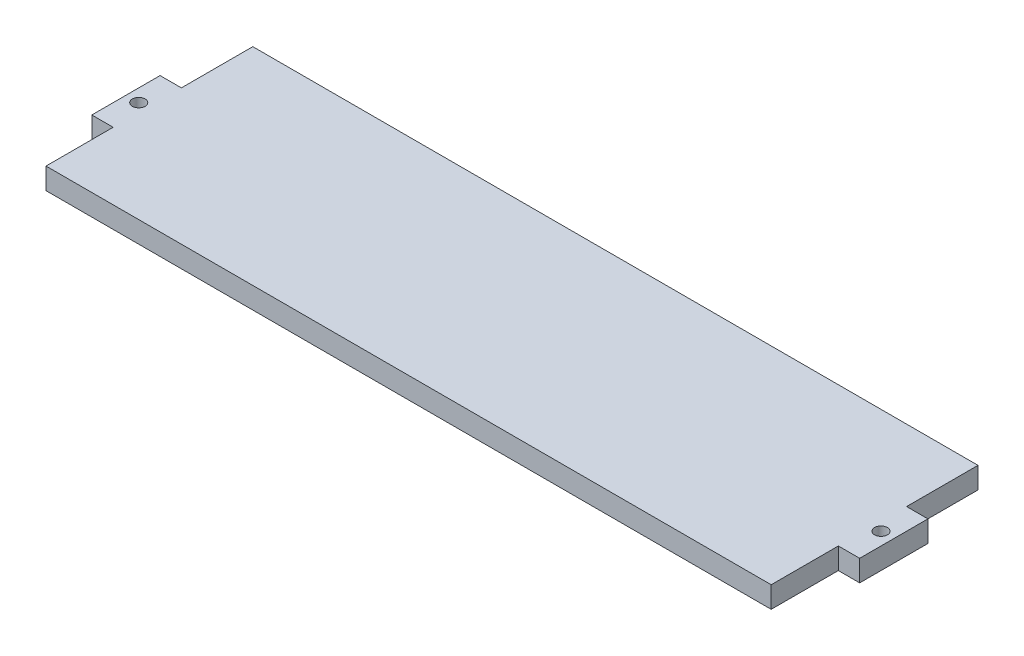
ISO-10303-21;
HEADER;
FILE_DESCRIPTION(('STEP AP214'),'2;1');
FILE_NAME('part.step','',(''),(''),'','','');
FILE_SCHEMA(('AUTOMOTIVE_DESIGN { 1 0 10303 214 1 1 1 1 }'));
ENDSEC;
DATA;
#1=APPLICATION_CONTEXT('core data for automotive mechanical design processes');
#2=APPLICATION_PROTOCOL_DEFINITION('international standard','automotive_design',2000,#1);
#3=PRODUCT_CONTEXT('',#1,'mechanical');
#4=PRODUCT('Part','Part','',(#3));
#5=PRODUCT_RELATED_PRODUCT_CATEGORY('part','',(#4));
#6=PRODUCT_DEFINITION_FORMATION('','',#4);
#7=PRODUCT_DEFINITION_CONTEXT('part definition',#1,'design');
#8=PRODUCT_DEFINITION('design','',#6,#7);
#9=PRODUCT_DEFINITION_SHAPE('','',#8);
#10=(LENGTH_UNIT() NAMED_UNIT(*) SI_UNIT(.MILLI.,.METRE.));
#11=(NAMED_UNIT(*) PLANE_ANGLE_UNIT() SI_UNIT($,.RADIAN.));
#12=(NAMED_UNIT(*) SI_UNIT($,.STERADIAN.) SOLID_ANGLE_UNIT());
#13=UNCERTAINTY_MEASURE_WITH_UNIT(LENGTH_MEASURE(1.E-05),#10,'distance_accuracy_value','');
#14=(GEOMETRIC_REPRESENTATION_CONTEXT(3) GLOBAL_UNCERTAINTY_ASSIGNED_CONTEXT((#13)) GLOBAL_UNIT_ASSIGNED_CONTEXT((#10,
#11,#12)) REPRESENTATION_CONTEXT('',''));
#15=CARTESIAN_POINT('',(0.,0.,0.));
#16=DIRECTION('',(0.,0.,1.));
#17=DIRECTION('',(1.,0.,0.));
#18=AXIS2_PLACEMENT_3D('',#15,#16,#17);
#19=CARTESIAN_POINT('',(90.0000000000002,5.,7.99999999999999));
#20=DIRECTION('',(0.,0.,-1.));
#21=DIRECTION('',(-1.,0.,0.));
#22=AXIS2_PLACEMENT_3D('',#19,#20,#21);
#23=PLANE('',#22);
#24=DIRECTION('',(0.,1.,0.));
#25=VECTOR('',#24,1.);
#26=CARTESIAN_POINT('',(85.,0.,8.00000000000002));
#27=LINE('',#26,#25);
#28=CARTESIAN_POINT('',(85.,0.,8.00000000000002));
#29=VERTEX_POINT('',#28);
#30=CARTESIAN_POINT('',(85.,5.,8.00000000000002));
#31=VERTEX_POINT('',#30);
#32=EDGE_CURVE('E152',#29,#31,#27,.T.);
#33=ORIENTED_EDGE('',*,*,#32,.F.);
#34=DIRECTION('',(1.,0.,0.));
#35=VECTOR('',#34,1.);
#36=CARTESIAN_POINT('',(90.0000000000002,0.,7.99999999999999));
#37=LINE('',#36,#35);
#38=CARTESIAN_POINT('',(90.0000000000002,0.,7.99999999999999));
#39=VERTEX_POINT('',#38);
#40=EDGE_CURVE('E179',#29,#39,#37,.T.);
#41=ORIENTED_EDGE('',*,*,#40,.T.);
#42=DIRECTION('',(0.,-1.,0.));
#43=VECTOR('',#42,1.);
#44=CARTESIAN_POINT('',(90.0000000000002,5.,7.99999999999999));
#45=LINE('',#44,#43);
#46=CARTESIAN_POINT('',(90.0000000000002,5.,7.99999999999999));
#47=VERTEX_POINT('',#46);
#48=EDGE_CURVE('E193',#47,#39,#45,.T.);
#49=ORIENTED_EDGE('',*,*,#48,.F.);
#50=DIRECTION('',(1.,0.,0.));
#51=VECTOR('',#50,1.);
#52=CARTESIAN_POINT('',(90.0000000000002,5.,7.99999999999999));
#53=LINE('',#52,#51);
#54=EDGE_CURVE('E166',#31,#47,#53,.T.);
#55=ORIENTED_EDGE('',*,*,#54,.F.);
#56=EDGE_LOOP('',(#33,#41,#49,#55));
#57=FACE_BOUND('',#56,.T.);
#58=ADVANCED_FACE('F40',(#57),#23,.F.);
#59=CARTESIAN_POINT('',(90.0000000000002,5.,-8.00000000000001));
#60=DIRECTION('',(0.,0.,1.));
#61=DIRECTION('',(1.,0.,0.));
#62=AXIS2_PLACEMENT_3D('',#59,#60,#61);
#63=PLANE('',#62);
#64=DIRECTION('',(0.,1.,0.));
#65=VECTOR('',#64,1.);
#66=CARTESIAN_POINT('',(-84.9999999999999,0.,-8.00000000000001));
#67=LINE('',#66,#65);
#68=CARTESIAN_POINT('',(-84.9999999999999,0.,-8.00000000000001));
#69=VERTEX_POINT('',#68);
#70=CARTESIAN_POINT('',(-84.9999999999999,5.,-8.00000000000001));
#71=VERTEX_POINT('',#70);
#72=EDGE_CURVE('E145',#69,#71,#67,.T.);
#73=ORIENTED_EDGE('',*,*,#72,.F.);
#74=DIRECTION('',(-1.,0.,0.));
#75=VECTOR('',#74,1.);
#76=CARTESIAN_POINT('',(90.0000000000002,0.,-8.00000000000001));
#77=LINE('',#76,#75);
#78=CARTESIAN_POINT('',(-89.9999999999998,0.,-7.99999999999998));
#79=VERTEX_POINT('',#78);
#80=EDGE_CURVE('E185',#69,#79,#77,.T.);
#81=ORIENTED_EDGE('',*,*,#80,.T.);
#82=DIRECTION('',(0.,-1.,0.));
#83=VECTOR('',#82,1.);
#84=CARTESIAN_POINT('',(-89.9999999999998,5.,-7.99999999999998));
#85=LINE('',#84,#83);
#86=CARTESIAN_POINT('',(-89.9999999999998,5.,-7.99999999999998));
#87=VERTEX_POINT('',#86);
#88=EDGE_CURVE('E176',#87,#79,#85,.T.);
#89=ORIENTED_EDGE('',*,*,#88,.F.);
#90=DIRECTION('',(-1.,0.,0.));
#91=VECTOR('',#90,1.);
#92=CARTESIAN_POINT('',(90.0000000000002,5.,-8.00000000000001));
#93=LINE('',#92,#91);
#94=EDGE_CURVE('E173',#71,#87,#93,.T.);
#95=ORIENTED_EDGE('',*,*,#94,.F.);
#96=EDGE_LOOP('',(#73,#81,#89,#95));
#97=FACE_BOUND('',#96,.T.);
#98=ADVANCED_FACE('F278',(#97),#63,.F.);
#99=CARTESIAN_POINT('',(-89.9999999999998,5.,8.00000000000002));
#100=DIRECTION('',(1.,0.,0.));
#101=DIRECTION('',(0.,0.,-1.));
#102=AXIS2_PLACEMENT_3D('',#99,#100,#101);
#103=PLANE('',#102);
#104=DIRECTION('',(0.,0.,1.));
#105=VECTOR('',#104,1.);
#106=CARTESIAN_POINT('',(-89.9999999999998,0.,8.00000000000002));
#107=LINE('',#106,#105);
#108=CARTESIAN_POINT('',(-89.9999999999998,0.,8.00000000000002));
#109=VERTEX_POINT('',#108);
#110=EDGE_CURVE('E161',#79,#109,#107,.T.);
#111=ORIENTED_EDGE('',*,*,#110,.T.);
#112=DIRECTION('',(0.,-1.,0.));
#113=VECTOR('',#112,1.);
#114=CARTESIAN_POINT('',(-89.9999999999998,5.,8.00000000000002));
#115=LINE('',#114,#113);
#116=CARTESIAN_POINT('',(-89.9999999999998,5.,8.00000000000002));
#117=VERTEX_POINT('',#116);
#118=EDGE_CURVE('E48',#117,#109,#115,.T.);
#119=ORIENTED_EDGE('',*,*,#118,.F.);
#120=DIRECTION('',(0.,0.,1.));
#121=VECTOR('',#120,1.);
#122=CARTESIAN_POINT('',(-89.9999999999998,5.,8.00000000000002));
#123=LINE('',#122,#121);
#124=EDGE_CURVE('E163',#87,#117,#123,.T.);
#125=ORIENTED_EDGE('',*,*,#124,.F.);
#126=ORIENTED_EDGE('',*,*,#88,.T.);
#127=EDGE_LOOP('',(#111,#119,#125,#126));
#128=FACE_BOUND('',#127,.T.);
#129=ADVANCED_FACE('F42',(#128),#103,.F.);
#130=CARTESIAN_POINT('',(-85.,0.,8.00000000000002));
#131=VERTEX_POINT('',#130);
#132=EDGE_CURVE('E180',#109,#131,#37,.T.);
#133=ORIENTED_EDGE('',*,*,#132,.T.);
#134=DIRECTION('',(0.,1.,0.));
#135=VECTOR('',#134,1.);
#136=CARTESIAN_POINT('',(-85.,0.,8.00000000000002));
#137=LINE('',#136,#135);
#138=CARTESIAN_POINT('',(-85.,5.,8.00000000000002));
#139=VERTEX_POINT('',#138);
#140=EDGE_CURVE('E147',#131,#139,#137,.T.);
#141=ORIENTED_EDGE('',*,*,#140,.T.);
#142=EDGE_CURVE('E168',#117,#139,#53,.T.);
#143=ORIENTED_EDGE('',*,*,#142,.F.);
#144=ORIENTED_EDGE('',*,*,#118,.T.);
#145=EDGE_LOOP('',(#133,#141,#143,#144));
#146=FACE_BOUND('',#145,.T.);
#147=ADVANCED_FACE('F198',(#146),#23,.F.);
#148=CARTESIAN_POINT('',(90.0000000000002,5.,7.99999999999999));
#149=DIRECTION('',(-1.,0.,0.));
#150=DIRECTION('',(0.,0.,1.));
#151=AXIS2_PLACEMENT_3D('',#148,#149,#150);
#152=PLANE('',#151);
#153=DIRECTION('',(0.,0.,-1.));
#154=VECTOR('',#153,1.);
#155=CARTESIAN_POINT('',(90.0000000000002,0.,7.99999999999999));
#156=LINE('',#155,#154);
#157=CARTESIAN_POINT('',(90.0000000000002,0.,-8.00000000000001));
#158=VERTEX_POINT('',#157);
#159=EDGE_CURVE('E183',#39,#158,#156,.T.);
#160=ORIENTED_EDGE('',*,*,#159,.T.);
#161=DIRECTION('',(0.,-1.,0.));
#162=VECTOR('',#161,1.);
#163=CARTESIAN_POINT('',(90.0000000000002,5.,-8.00000000000001));
#164=LINE('',#163,#162);
#165=CARTESIAN_POINT('',(90.0000000000002,5.,-8.00000000000001));
#166=VERTEX_POINT('',#165);
#167=EDGE_CURVE('E190',#166,#158,#164,.T.);
#168=ORIENTED_EDGE('',*,*,#167,.F.);
#169=DIRECTION('',(0.,0.,-1.));
#170=VECTOR('',#169,1.);
#171=CARTESIAN_POINT('',(90.0000000000002,5.,7.99999999999999));
#172=LINE('',#171,#170);
#173=EDGE_CURVE('E171',#47,#166,#172,.T.);
#174=ORIENTED_EDGE('',*,*,#173,.F.);
#175=ORIENTED_EDGE('',*,*,#48,.T.);
#176=EDGE_LOOP('',(#160,#168,#174,#175));
#177=FACE_BOUND('',#176,.T.);
#178=ADVANCED_FACE('F238',(#177),#152,.F.);
#179=CARTESIAN_POINT('',(85.0000000000001,0.,-8.00000000000001));
#180=VERTEX_POINT('',#179);
#181=EDGE_CURVE('E167',#158,#180,#77,.T.);
#182=ORIENTED_EDGE('',*,*,#181,.T.);
#183=DIRECTION('',(0.,1.,0.));
#184=VECTOR('',#183,1.);
#185=CARTESIAN_POINT('',(85.0000000000001,0.,-8.00000000000001));
#186=LINE('',#185,#184);
#187=CARTESIAN_POINT('',(85.0000000000001,5.,-8.00000000000001));
#188=VERTEX_POINT('',#187);
#189=EDGE_CURVE('E158',#180,#188,#186,.T.);
#190=ORIENTED_EDGE('',*,*,#189,.T.);
#191=EDGE_CURVE('E174',#166,#188,#93,.T.);
#192=ORIENTED_EDGE('',*,*,#191,.F.);
#193=ORIENTED_EDGE('',*,*,#167,.T.);
#194=EDGE_LOOP('',(#182,#190,#192,#193));
#195=FACE_BOUND('',#194,.T.);
#196=ADVANCED_FACE('F233',(#195),#63,.F.);
#197=CARTESIAN_POINT('',(0.,5.,0.));
#198=DIRECTION('',(0.,1.,0.));
#199=DIRECTION('',(0.,0.,1.));
#200=AXIS2_PLACEMENT_3D('',#197,#198,#199);
#201=PLANE('',#200);
#202=DIRECTION('',(1.,0.,0.));
#203=VECTOR('',#202,1.);
#204=CARTESIAN_POINT('',(-84.9999999999999,5.,-24.74));
#205=LINE('',#204,#203);
#206=CARTESIAN_POINT('',(-84.9999999999999,5.,-24.74));
#207=VERTEX_POINT('',#206);
#208=CARTESIAN_POINT('',(85.0000000000001,5.,-24.74));
#209=VERTEX_POINT('',#208);
#210=EDGE_CURVE('E54',#207,#209,#205,.T.);
#211=ORIENTED_EDGE('',*,*,#210,.F.);
#212=DIRECTION('',(0.,0.,1.));
#213=VECTOR('',#212,1.);
#214=CARTESIAN_POINT('',(-84.9999999999999,5.,-25.74));
#215=LINE('',#214,#213);
#216=EDGE_CURVE('E138',#207,#71,#215,.T.);
#217=ORIENTED_EDGE('',*,*,#216,.T.);
#218=ORIENTED_EDGE('',*,*,#94,.T.);
#219=ORIENTED_EDGE('',*,*,#124,.T.);
#220=ORIENTED_EDGE('',*,*,#142,.T.);
#221=DIRECTION('',(0.,0.,1.));
#222=VECTOR('',#221,1.);
#223=CARTESIAN_POINT('',(-85.,5.,25.74));
#224=LINE('',#223,#222);
#225=CARTESIAN_POINT('',(-85.,5.,23.74));
#226=VERTEX_POINT('',#225);
#227=EDGE_CURVE('E216',#139,#226,#224,.T.);
#228=ORIENTED_EDGE('',*,*,#227,.T.);
#229=DIRECTION('',(-1.,0.,0.));
#230=VECTOR('',#229,1.);
#231=CARTESIAN_POINT('',(-85.,5.,23.74));
#232=LINE('',#231,#230);
#233=CARTESIAN_POINT('',(85.,5.,23.74));
#234=VERTEX_POINT('',#233);
#235=EDGE_CURVE('E253',#234,#226,#232,.T.);
#236=ORIENTED_EDGE('',*,*,#235,.F.);
#237=DIRECTION('',(0.,0.,-1.));
#238=VECTOR('',#237,1.);
#239=CARTESIAN_POINT('',(85.,5.,25.74));
#240=LINE('',#239,#238);
#241=EDGE_CURVE('E213',#234,#31,#240,.T.);
#242=ORIENTED_EDGE('',*,*,#241,.T.);
#243=ORIENTED_EDGE('',*,*,#54,.T.);
#244=ORIENTED_EDGE('',*,*,#173,.T.);
#245=ORIENTED_EDGE('',*,*,#191,.T.);
#246=DIRECTION('',(0.,0.,-1.));
#247=VECTOR('',#246,1.);
#248=CARTESIAN_POINT('',(85.0000000000001,5.,-25.74));
#249=LINE('',#248,#247);
#250=EDGE_CURVE('E141',#188,#209,#249,.T.);
#251=ORIENTED_EDGE('',*,*,#250,.T.);
#252=EDGE_LOOP('',(#211,#217,#218,#219,#220,#228,#236,#242,#243,#244,#245,#251));
#253=FACE_BOUND('',#252,.T.);
#254=CARTESIAN_POINT('',(86.9999999999998,5.,0.));
#255=DIRECTION('',(0.,-1.,0.));
#256=DIRECTION('',(0.,0.,1.));
#257=AXIS2_PLACEMENT_3D('',#254,#255,#256);
#258=CIRCLE('',#257,1.5);
#259=CARTESIAN_POINT('',(86.9999999999998,5.,1.5));
#260=VERTEX_POINT('',#259);
#261=EDGE_CURVE('E251',#260,#260,#258,.T.);
#262=ORIENTED_EDGE('',*,*,#261,.T.);
#263=EDGE_LOOP('',(#262));
#264=FACE_BOUND('',#263,.T.);
#265=CARTESIAN_POINT('',(-86.9999999999998,5.,0.));
#266=DIRECTION('',(0.,1.,0.));
#267=DIRECTION('',(0.,0.,1.));
#268=AXIS2_PLACEMENT_3D('',#265,#266,#267);
#269=CIRCLE('',#268,1.5);
#270=CARTESIAN_POINT('',(-86.9999999999998,5.,1.5));
#271=VERTEX_POINT('',#270);
#272=EDGE_CURVE('E219',#271,#271,#269,.T.);
#273=ORIENTED_EDGE('',*,*,#272,.F.);
#274=EDGE_LOOP('',(#273));
#275=FACE_BOUND('',#274,.T.);
#276=ADVANCED_FACE('F136',(#253,#264,#275),#201,.T.);
#277=CARTESIAN_POINT('',(0.,0.,0.));
#278=DIRECTION('',(0.,1.,0.));
#279=DIRECTION('',(0.,0.,1.));
#280=AXIS2_PLACEMENT_3D('',#277,#278,#279);
#281=PLANE('',#280);
#282=CARTESIAN_POINT('',(86.9999999999998,0.,0.));
#283=DIRECTION('',(0.,-1.,0.));
#284=DIRECTION('',(0.,0.,1.));
#285=AXIS2_PLACEMENT_3D('',#282,#283,#284);
#286=CIRCLE('',#285,1.5);
#287=CARTESIAN_POINT('',(86.9999999999998,0.,1.5));
#288=VERTEX_POINT('',#287);
#289=EDGE_CURVE('E257',#288,#288,#286,.T.);
#290=ORIENTED_EDGE('',*,*,#289,.F.);
#291=EDGE_LOOP('',(#290));
#292=FACE_BOUND('',#291,.T.);
#293=CARTESIAN_POINT('',(-86.9999999999998,0.,0.));
#294=DIRECTION('',(0.,1.,0.));
#295=DIRECTION('',(0.,0.,1.));
#296=AXIS2_PLACEMENT_3D('',#293,#294,#295);
#297=CIRCLE('',#296,1.5);
#298=CARTESIAN_POINT('',(-86.9999999999998,0.,1.5));
#299=VERTEX_POINT('',#298);
#300=EDGE_CURVE('E223',#299,#299,#297,.T.);
#301=ORIENTED_EDGE('',*,*,#300,.T.);
#302=EDGE_LOOP('',(#301));
#303=FACE_BOUND('',#302,.T.);
#304=DIRECTION('',(0.,0.,1.));
#305=VECTOR('',#304,1.);
#306=CARTESIAN_POINT('',(-84.9999999999999,0.,-25.74));
#307=LINE('',#306,#305);
#308=CARTESIAN_POINT('',(-84.9999999999999,0.,-24.74));
#309=VERTEX_POINT('',#308);
#310=EDGE_CURVE('E149',#309,#69,#307,.T.);
#311=ORIENTED_EDGE('',*,*,#310,.F.);
#312=DIRECTION('',(1.,0.,0.));
#313=VECTOR('',#312,1.);
#314=CARTESIAN_POINT('',(0.,0.,-24.74));
#315=LINE('',#314,#313);
#316=CARTESIAN_POINT('',(85.0000000000001,0.,-24.74));
#317=VERTEX_POINT('',#316);
#318=EDGE_CURVE('E129',#309,#317,#315,.T.);
#319=ORIENTED_EDGE('',*,*,#318,.T.);
#320=DIRECTION('',(0.,0.,-1.));
#321=VECTOR('',#320,1.);
#322=CARTESIAN_POINT('',(85.0000000000001,0.,-25.74));
#323=LINE('',#322,#321);
#324=EDGE_CURVE('E155',#180,#317,#323,.T.);
#325=ORIENTED_EDGE('',*,*,#324,.F.);
#326=ORIENTED_EDGE('',*,*,#181,.F.);
#327=ORIENTED_EDGE('',*,*,#159,.F.);
#328=ORIENTED_EDGE('',*,*,#40,.F.);
#329=DIRECTION('',(0.,0.,-1.));
#330=VECTOR('',#329,1.);
#331=CARTESIAN_POINT('',(85.,0.,25.74));
#332=LINE('',#331,#330);
#333=CARTESIAN_POINT('',(85.,0.,23.74));
#334=VERTEX_POINT('',#333);
#335=EDGE_CURVE('E212',#334,#29,#332,.T.);
#336=ORIENTED_EDGE('',*,*,#335,.F.);
#337=DIRECTION('',(-1.,0.,0.));
#338=VECTOR('',#337,1.);
#339=CARTESIAN_POINT('',(-85.,0.,23.74));
#340=LINE('',#339,#338);
#341=CARTESIAN_POINT('',(-85.,0.,23.74));
#342=VERTEX_POINT('',#341);
#343=EDGE_CURVE('E62',#334,#342,#340,.T.);
#344=ORIENTED_EDGE('',*,*,#343,.T.);
#345=DIRECTION('',(0.,0.,1.));
#346=VECTOR('',#345,1.);
#347=CARTESIAN_POINT('',(-85.,0.,25.74));
#348=LINE('',#347,#346);
#349=EDGE_CURVE('E208',#131,#342,#348,.T.);
#350=ORIENTED_EDGE('',*,*,#349,.F.);
#351=ORIENTED_EDGE('',*,*,#132,.F.);
#352=ORIENTED_EDGE('',*,*,#110,.F.);
#353=ORIENTED_EDGE('',*,*,#80,.F.);
#354=EDGE_LOOP('',(#311,#319,#325,#326,#327,#328,#336,#344,#350,#351,#352,#353));
#355=FACE_BOUND('',#354,.T.);
#356=ADVANCED_FACE('F205',(#292,#303,#355),#281,.F.);
#357=CARTESIAN_POINT('',(-84.9999999999999,0.,-25.74));
#358=DIRECTION('',(-1.,0.,0.));
#359=DIRECTION('',(0.,0.,1.));
#360=AXIS2_PLACEMENT_3D('',#357,#358,#359);
#361=PLANE('',#360);
#362=DIRECTION('',(0.,1.,0.));
#363=VECTOR('',#362,1.);
#364=CARTESIAN_POINT('',(-84.9999999999999,-5.,-24.74));
#365=LINE('',#364,#363);
#366=EDGE_CURVE('E126',#309,#207,#365,.T.);
#367=ORIENTED_EDGE('',*,*,#366,.F.);
#368=ORIENTED_EDGE('',*,*,#310,.T.);
#369=ORIENTED_EDGE('',*,*,#72,.T.);
#370=ORIENTED_EDGE('',*,*,#216,.F.);
#371=EDGE_LOOP('',(#367,#368,#369,#370));
#372=FACE_BOUND('',#371,.T.);
#373=ADVANCED_FACE('F143',(#372),#361,.T.);
#374=CARTESIAN_POINT('',(85.0000000000001,0.,-25.74));
#375=DIRECTION('',(1.,0.,0.));
#376=DIRECTION('',(0.,0.,-1.));
#377=AXIS2_PLACEMENT_3D('',#374,#375,#376);
#378=PLANE('',#377);
#379=DIRECTION('',(0.,-1.,0.));
#380=VECTOR('',#379,1.);
#381=CARTESIAN_POINT('',(85.0000000000001,0.,-24.74));
#382=LINE('',#381,#380);
#383=EDGE_CURVE('E11',#209,#317,#382,.T.);
#384=ORIENTED_EDGE('',*,*,#383,.F.);
#385=ORIENTED_EDGE('',*,*,#250,.F.);
#386=ORIENTED_EDGE('',*,*,#189,.F.);
#387=ORIENTED_EDGE('',*,*,#324,.T.);
#388=EDGE_LOOP('',(#384,#385,#386,#387));
#389=FACE_BOUND('',#388,.T.);
#390=ADVANCED_FACE('F229',(#389),#378,.T.);
#391=CARTESIAN_POINT('',(-85.,0.,25.74));
#392=DIRECTION('',(-1.,0.,0.));
#393=DIRECTION('',(0.,0.,1.));
#394=AXIS2_PLACEMENT_3D('',#391,#392,#393);
#395=PLANE('',#394);
#396=DIRECTION('',(0.,1.,0.));
#397=VECTOR('',#396,1.);
#398=CARTESIAN_POINT('',(-85.,0.,23.74));
#399=LINE('',#398,#397);
#400=EDGE_CURVE('E249',#342,#226,#399,.T.);
#401=ORIENTED_EDGE('',*,*,#400,.T.);
#402=ORIENTED_EDGE('',*,*,#227,.F.);
#403=ORIENTED_EDGE('',*,*,#140,.F.);
#404=ORIENTED_EDGE('',*,*,#349,.T.);
#405=EDGE_LOOP('',(#401,#402,#403,#404));
#406=FACE_BOUND('',#405,.T.);
#407=ADVANCED_FACE('F342',(#406),#395,.T.);
#408=CARTESIAN_POINT('',(85.,0.,25.74));
#409=DIRECTION('',(1.,0.,0.));
#410=DIRECTION('',(0.,0.,-1.));
#411=AXIS2_PLACEMENT_3D('',#408,#409,#410);
#412=PLANE('',#411);
#413=DIRECTION('',(0.,1.,0.));
#414=VECTOR('',#413,1.);
#415=CARTESIAN_POINT('',(85.,0.,23.74));
#416=LINE('',#415,#414);
#417=EDGE_CURVE('E247',#334,#234,#416,.T.);
#418=ORIENTED_EDGE('',*,*,#417,.F.);
#419=ORIENTED_EDGE('',*,*,#335,.T.);
#420=ORIENTED_EDGE('',*,*,#32,.T.);
#421=ORIENTED_EDGE('',*,*,#241,.F.);
#422=EDGE_LOOP('',(#418,#419,#420,#421));
#423=FACE_BOUND('',#422,.T.);
#424=ADVANCED_FACE('F246',(#423),#412,.T.);
#425=CARTESIAN_POINT('',(-86.9999999999998,0.,0.));
#426=DIRECTION('',(0.,1.,0.));
#427=DIRECTION('',(0.,0.,1.));
#428=AXIS2_PLACEMENT_3D('',#425,#426,#427);
#429=CYLINDRICAL_SURFACE('',#428,1.5);
#430=ORIENTED_EDGE('',*,*,#300,.F.);
#431=EDGE_LOOP('',(#430));
#432=FACE_BOUND('',#431,.T.);
#433=ORIENTED_EDGE('',*,*,#272,.T.);
#434=EDGE_LOOP('',(#433));
#435=FACE_BOUND('',#434,.T.);
#436=ADVANCED_FACE('F267',(#432,#435),#429,.F.);
#437=CARTESIAN_POINT('',(86.9999999999998,0.,0.));
#438=DIRECTION('',(0.,1.,0.));
#439=DIRECTION('',(0.,0.,1.));
#440=AXIS2_PLACEMENT_3D('',#437,#438,#439);
#441=CYLINDRICAL_SURFACE('',#440,1.5);
#442=ORIENTED_EDGE('',*,*,#289,.T.);
#443=EDGE_LOOP('',(#442));
#444=FACE_BOUND('',#443,.T.);
#445=ORIENTED_EDGE('',*,*,#261,.F.);
#446=EDGE_LOOP('',(#445));
#447=FACE_BOUND('',#446,.T.);
#448=ADVANCED_FACE('F322',(#444,#447),#441,.F.);
#449=CARTESIAN_POINT('',(-85.,0.,23.74));
#450=DIRECTION('',(0.,0.,-1.));
#451=DIRECTION('',(-1.,0.,0.));
#452=AXIS2_PLACEMENT_3D('',#449,#450,#451);
#453=PLANE('',#452);
#454=ORIENTED_EDGE('',*,*,#235,.T.);
#455=ORIENTED_EDGE('',*,*,#400,.F.);
#456=ORIENTED_EDGE('',*,*,#343,.F.);
#457=ORIENTED_EDGE('',*,*,#417,.T.);
#458=EDGE_LOOP('',(#454,#455,#456,#457));
#459=FACE_BOUND('',#458,.T.);
#460=ADVANCED_FACE('F334',(#459),#453,.F.);
#461=CARTESIAN_POINT('',(-84.9999999999999,-5.,-24.74));
#462=DIRECTION('',(0.,0.,1.));
#463=DIRECTION('',(1.,0.,0.));
#464=AXIS2_PLACEMENT_3D('',#461,#462,#463);
#465=PLANE('',#464);
#466=ORIENTED_EDGE('',*,*,#366,.T.);
#467=ORIENTED_EDGE('',*,*,#210,.T.);
#468=ORIENTED_EDGE('',*,*,#383,.T.);
#469=ORIENTED_EDGE('',*,*,#318,.F.);
#470=EDGE_LOOP('',(#466,#467,#468,#469));
#471=FACE_BOUND('',#470,.T.);
#472=ADVANCED_FACE('F127',(#471),#465,.F.);
#473=CLOSED_SHELL('',(#58,#98,#129,#147,#178,#196,#276,#356,#373,#390,#407,#424,#436,#448,#460,#472));
#474=MANIFOLD_SOLID_BREP('B2',#473);
#475=ADVANCED_BREP_SHAPE_REPRESENTATION('',(#18,#474),#14);
#476=SHAPE_DEFINITION_REPRESENTATION(#9,#475);
ENDSEC;
END-ISO-10303-21;
